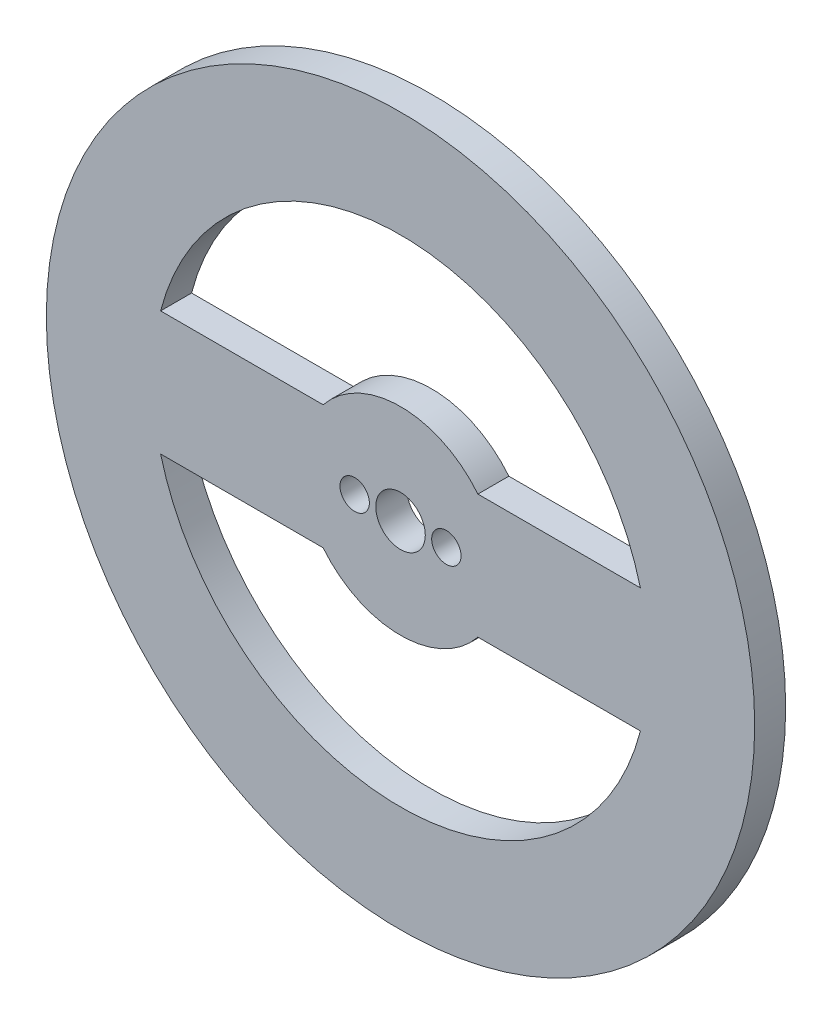
ISO-10303-21;
HEADER;
FILE_DESCRIPTION(('STEP AP214'),'2;1');
FILE_NAME('part.step','',(''),(''),'','','');
FILE_SCHEMA(('AUTOMOTIVE_DESIGN { 1 0 10303 214 1 1 1 1 }'));
ENDSEC;
DATA;
#1=APPLICATION_CONTEXT('core data for automotive mechanical design processes');
#2=APPLICATION_PROTOCOL_DEFINITION('international standard','automotive_design',2000,#1);
#3=PRODUCT_CONTEXT('',#1,'mechanical');
#4=PRODUCT('Part','Part','',(#3));
#5=PRODUCT_RELATED_PRODUCT_CATEGORY('part','',(#4));
#6=PRODUCT_DEFINITION_FORMATION('','',#4);
#7=PRODUCT_DEFINITION_CONTEXT('part definition',#1,'design');
#8=PRODUCT_DEFINITION('design','',#6,#7);
#9=PRODUCT_DEFINITION_SHAPE('','',#8);
#10=(LENGTH_UNIT() NAMED_UNIT(*) SI_UNIT(.MILLI.,.METRE.));
#11=(NAMED_UNIT(*) PLANE_ANGLE_UNIT() SI_UNIT($,.RADIAN.));
#12=(NAMED_UNIT(*) SI_UNIT($,.STERADIAN.) SOLID_ANGLE_UNIT());
#13=UNCERTAINTY_MEASURE_WITH_UNIT(LENGTH_MEASURE(1.E-05),#10,'distance_accuracy_value','');
#14=(GEOMETRIC_REPRESENTATION_CONTEXT(3) GLOBAL_UNCERTAINTY_ASSIGNED_CONTEXT((#13)) GLOBAL_UNIT_ASSIGNED_CONTEXT((#10,
#11,#12)) REPRESENTATION_CONTEXT('',''));
#15=CARTESIAN_POINT('',(0.,0.,0.));
#16=DIRECTION('',(0.,0.,1.));
#17=DIRECTION('',(1.,0.,0.));
#18=AXIS2_PLACEMENT_3D('',#15,#16,#17);
#19=CARTESIAN_POINT('',(0.,0.,3.175));
#20=DIRECTION('',(0.,0.,-1.));
#21=DIRECTION('',(-1.,0.,0.));
#22=AXIS2_PLACEMENT_3D('',#19,#20,#21);
#23=CYLINDRICAL_SURFACE('',#22,36.3093);
#24=CARTESIAN_POINT('',(0.,0.,3.175));
#25=DIRECTION('',(0.,0.,1.));
#26=DIRECTION('',(1.,0.,0.));
#27=AXIS2_PLACEMENT_3D('',#24,#25,#26);
#28=CIRCLE('',#27,36.3093);
#29=CARTESIAN_POINT('',(36.3093,0.,3.175));
#30=VERTEX_POINT('',#29);
#31=EDGE_CURVE('E11',#30,#30,#28,.T.);
#32=ORIENTED_EDGE('',*,*,#31,.F.);
#33=EDGE_LOOP('',(#32));
#34=FACE_BOUND('',#33,.T.);
#35=CARTESIAN_POINT('',(0.,0.,0.));
#36=DIRECTION('',(0.,0.,1.));
#37=DIRECTION('',(1.,0.,0.));
#38=AXIS2_PLACEMENT_3D('',#35,#36,#37);
#39=CIRCLE('',#38,36.3093);
#40=CARTESIAN_POINT('',(36.3093,0.,0.));
#41=VERTEX_POINT('',#40);
#42=EDGE_CURVE('E36',#41,#41,#39,.T.);
#43=ORIENTED_EDGE('',*,*,#42,.T.);
#44=EDGE_LOOP('',(#43));
#45=FACE_BOUND('',#44,.T.);
#46=ADVANCED_FACE('F33',(#34,#45),#23,.T.);
#47=CARTESIAN_POINT('',(0.,0.,3.175));
#48=DIRECTION('',(0.,0.,1.));
#49=DIRECTION('',(1.,0.,0.));
#50=AXIS2_PLACEMENT_3D('',#47,#48,#49);
#51=PLANE('',#50);
#52=CARTESIAN_POINT('',(0.,0.,3.175));
#53=DIRECTION('',(0.,0.,1.));
#54=DIRECTION('',(1.,0.,0.));
#55=AXIS2_PLACEMENT_3D('',#52,#53,#54);
#56=CIRCLE('',#55,2.54);
#57=CARTESIAN_POINT('',(2.54,0.,3.175));
#58=VERTEX_POINT('',#57);
#59=EDGE_CURVE('E251',#58,#58,#56,.T.);
#60=ORIENTED_EDGE('',*,*,#59,.F.);
#61=EDGE_LOOP('',(#60));
#62=FACE_BOUND('',#61,.T.);
#63=CARTESIAN_POINT('',(4.699,0.,3.175));
#64=DIRECTION('',(0.,0.,1.));
#65=DIRECTION('',(1.,0.,0.));
#66=AXIS2_PLACEMENT_3D('',#63,#64,#65);
#67=CIRCLE('',#66,1.505);
#68=CARTESIAN_POINT('',(6.204,0.,3.175));
#69=VERTEX_POINT('',#68);
#70=EDGE_CURVE('E253',#69,#69,#67,.T.);
#71=ORIENTED_EDGE('',*,*,#70,.F.);
#72=EDGE_LOOP('',(#71));
#73=FACE_BOUND('',#72,.T.);
#74=CARTESIAN_POINT('',(-4.699,0.,3.175));
#75=DIRECTION('',(0.,0.,1.));
#76=DIRECTION('',(1.,0.,0.));
#77=AXIS2_PLACEMENT_3D('',#74,#75,#76);
#78=CIRCLE('',#77,1.505);
#79=CARTESIAN_POINT('',(-3.194,0.,3.175));
#80=VERTEX_POINT('',#79);
#81=EDGE_CURVE('E121',#80,#80,#78,.T.);
#82=ORIENTED_EDGE('',*,*,#81,.F.);
#83=EDGE_LOOP('',(#82));
#84=FACE_BOUND('',#83,.T.);
#85=CARTESIAN_POINT('',(0.,0.,3.175));
#86=DIRECTION('',(0.,0.,1.));
#87=DIRECTION('',(1.,0.,0.));
#88=AXIS2_PLACEMENT_3D('',#85,#86,#87);
#89=CIRCLE('',#88,25.4);
#90=CARTESIAN_POINT('',(-24.5934442484171,-6.35,3.175));
#91=VERTEX_POINT('',#90);
#92=CARTESIAN_POINT('',(24.5934442484171,-6.35,3.175));
#93=VERTEX_POINT('',#92);
#94=EDGE_CURVE('E47',#91,#93,#89,.T.);
#95=ORIENTED_EDGE('',*,*,#94,.F.);
#96=DIRECTION('',(-1.,0.,0.));
#97=VECTOR('',#96,1.);
#98=CARTESIAN_POINT('',(-24.5934442484171,-6.35,3.175));
#99=LINE('',#98,#97);
#100=CARTESIAN_POINT('',(-7.93114745796597,-6.35,3.175));
#101=VERTEX_POINT('',#100);
#102=EDGE_CURVE('E115',#101,#91,#99,.T.);
#103=ORIENTED_EDGE('',*,*,#102,.F.);
#104=CARTESIAN_POINT('',(0.,0.,3.175));
#105=DIRECTION('',(0.,0.,-1.));
#106=DIRECTION('',(1.,0.,0.));
#107=AXIS2_PLACEMENT_3D('',#104,#105,#106);
#108=CIRCLE('',#107,10.16);
#109=CARTESIAN_POINT('',(7.93114745796596,-6.35,3.175));
#110=VERTEX_POINT('',#109);
#111=EDGE_CURVE('E118',#110,#101,#108,.T.);
#112=ORIENTED_EDGE('',*,*,#111,.F.);
#113=DIRECTION('',(-1.,0.,0.));
#114=VECTOR('',#113,1.);
#115=CARTESIAN_POINT('',(7.93114745796597,-6.35,3.175));
#116=LINE('',#115,#114);
#117=EDGE_CURVE('E127',#93,#110,#116,.T.);
#118=ORIENTED_EDGE('',*,*,#117,.F.);
#119=EDGE_LOOP('',(#95,#103,#112,#118));
#120=FACE_BOUND('',#119,.T.);
#121=CARTESIAN_POINT('',(0.,0.,3.175));
#122=DIRECTION('',(0.,0.,-1.));
#123=DIRECTION('',(1.,0.,0.));
#124=AXIS2_PLACEMENT_3D('',#121,#122,#123);
#125=CIRCLE('',#124,10.16);
#126=CARTESIAN_POINT('',(-7.93114745796597,6.35,3.175));
#127=VERTEX_POINT('',#126);
#128=CARTESIAN_POINT('',(7.93114745796597,6.35,3.175));
#129=VERTEX_POINT('',#128);
#130=EDGE_CURVE('E134',#127,#129,#125,.T.);
#131=ORIENTED_EDGE('',*,*,#130,.F.);
#132=DIRECTION('',(1.,0.,0.));
#133=VECTOR('',#132,1.);
#134=CARTESIAN_POINT('',(-24.5934442484171,6.35,3.175));
#135=LINE('',#134,#133);
#136=CARTESIAN_POINT('',(-24.5934442484171,6.35,3.175));
#137=VERTEX_POINT('',#136);
#138=EDGE_CURVE('E142',#137,#127,#135,.T.);
#139=ORIENTED_EDGE('',*,*,#138,.F.);
#140=CARTESIAN_POINT('',(0.,0.,3.175));
#141=DIRECTION('',(0.,0.,1.));
#142=DIRECTION('',(1.,0.,0.));
#143=AXIS2_PLACEMENT_3D('',#140,#141,#142);
#144=CIRCLE('',#143,25.4);
#145=CARTESIAN_POINT('',(24.5934442484171,6.35,3.175));
#146=VERTEX_POINT('',#145);
#147=EDGE_CURVE('E156',#146,#137,#144,.T.);
#148=ORIENTED_EDGE('',*,*,#147,.F.);
#149=DIRECTION('',(1.,0.,0.));
#150=VECTOR('',#149,1.);
#151=CARTESIAN_POINT('',(7.93114745796597,6.35,3.175));
#152=LINE('',#151,#150);
#153=EDGE_CURVE('E153',#129,#146,#152,.T.);
#154=ORIENTED_EDGE('',*,*,#153,.F.);
#155=EDGE_LOOP('',(#131,#139,#148,#154));
#156=FACE_BOUND('',#155,.T.);
#157=ORIENTED_EDGE('',*,*,#31,.T.);
#158=EDGE_LOOP('',(#157));
#159=FACE_BOUND('',#158,.T.);
#160=ADVANCED_FACE('F178',(#62,#73,#84,#120,#156,#159),#51,.T.);
#161=CARTESIAN_POINT('',(0.,0.,0.));
#162=DIRECTION('',(0.,0.,1.));
#163=DIRECTION('',(1.,0.,0.));
#164=AXIS2_PLACEMENT_3D('',#161,#162,#163);
#165=PLANE('',#164);
#166=CARTESIAN_POINT('',(0.,0.,0.));
#167=DIRECTION('',(0.,0.,1.));
#168=DIRECTION('',(1.,0.,0.));
#169=AXIS2_PLACEMENT_3D('',#166,#167,#168);
#170=CIRCLE('',#169,2.54);
#171=CARTESIAN_POINT('',(2.54,0.,0.));
#172=VERTEX_POINT('',#171);
#173=EDGE_CURVE('E248',#172,#172,#170,.T.);
#174=ORIENTED_EDGE('',*,*,#173,.T.);
#175=EDGE_LOOP('',(#174));
#176=FACE_BOUND('',#175,.T.);
#177=CARTESIAN_POINT('',(4.699,0.,0.));
#178=DIRECTION('',(0.,0.,1.));
#179=DIRECTION('',(1.,0.,0.));
#180=AXIS2_PLACEMENT_3D('',#177,#178,#179);
#181=CIRCLE('',#180,1.505);
#182=CARTESIAN_POINT('',(6.204,0.,0.));
#183=VERTEX_POINT('',#182);
#184=EDGE_CURVE('E256',#183,#183,#181,.T.);
#185=ORIENTED_EDGE('',*,*,#184,.T.);
#186=EDGE_LOOP('',(#185));
#187=FACE_BOUND('',#186,.T.);
#188=CARTESIAN_POINT('',(-4.699,0.,0.));
#189=DIRECTION('',(0.,0.,1.));
#190=DIRECTION('',(1.,0.,0.));
#191=AXIS2_PLACEMENT_3D('',#188,#189,#190);
#192=CIRCLE('',#191,1.505);
#193=CARTESIAN_POINT('',(-3.194,0.,0.));
#194=VERTEX_POINT('',#193);
#195=EDGE_CURVE('E128',#194,#194,#192,.T.);
#196=ORIENTED_EDGE('',*,*,#195,.T.);
#197=EDGE_LOOP('',(#196));
#198=FACE_BOUND('',#197,.T.);
#199=DIRECTION('',(-1.,0.,0.));
#200=VECTOR('',#199,1.);
#201=CARTESIAN_POINT('',(-24.5934442484171,-6.35,0.));
#202=LINE('',#201,#200);
#203=CARTESIAN_POINT('',(-7.93114745796597,-6.35,0.));
#204=VERTEX_POINT('',#203);
#205=CARTESIAN_POINT('',(-24.5934442484171,-6.35,0.));
#206=VERTEX_POINT('',#205);
#207=EDGE_CURVE('E105',#204,#206,#202,.T.);
#208=ORIENTED_EDGE('',*,*,#207,.T.);
#209=CARTESIAN_POINT('',(0.,0.,0.));
#210=DIRECTION('',(0.,0.,1.));
#211=DIRECTION('',(1.,0.,0.));
#212=AXIS2_PLACEMENT_3D('',#209,#210,#211);
#213=CIRCLE('',#212,25.4);
#214=CARTESIAN_POINT('',(24.5934442484171,-6.35,0.));
#215=VERTEX_POINT('',#214);
#216=EDGE_CURVE('E99',#206,#215,#213,.T.);
#217=ORIENTED_EDGE('',*,*,#216,.T.);
#218=DIRECTION('',(-1.,0.,0.));
#219=VECTOR('',#218,1.);
#220=CARTESIAN_POINT('',(7.93114745796597,-6.35,0.));
#221=LINE('',#220,#219);
#222=CARTESIAN_POINT('',(7.93114745796596,-6.35,0.));
#223=VERTEX_POINT('',#222);
#224=EDGE_CURVE('E108',#215,#223,#221,.T.);
#225=ORIENTED_EDGE('',*,*,#224,.T.);
#226=CARTESIAN_POINT('',(0.,0.,0.));
#227=DIRECTION('',(0.,0.,-1.));
#228=DIRECTION('',(1.,0.,0.));
#229=AXIS2_PLACEMENT_3D('',#226,#227,#228);
#230=CIRCLE('',#229,10.16);
#231=EDGE_CURVE('E55',#223,#204,#230,.T.);
#232=ORIENTED_EDGE('',*,*,#231,.T.);
#233=EDGE_LOOP('',(#208,#217,#225,#232));
#234=FACE_BOUND('',#233,.T.);
#235=DIRECTION('',(1.,0.,0.));
#236=VECTOR('',#235,1.);
#237=CARTESIAN_POINT('',(-24.5934442484171,6.35,0.));
#238=LINE('',#237,#236);
#239=CARTESIAN_POINT('',(-24.5934442484171,6.35,0.));
#240=VERTEX_POINT('',#239);
#241=CARTESIAN_POINT('',(-7.93114745796597,6.35,0.));
#242=VERTEX_POINT('',#241);
#243=EDGE_CURVE('E148',#240,#242,#238,.T.);
#244=ORIENTED_EDGE('',*,*,#243,.T.);
#245=CARTESIAN_POINT('',(0.,0.,0.));
#246=DIRECTION('',(0.,0.,-1.));
#247=DIRECTION('',(1.,0.,0.));
#248=AXIS2_PLACEMENT_3D('',#245,#246,#247);
#249=CIRCLE('',#248,10.16);
#250=CARTESIAN_POINT('',(7.93114745796597,6.35,0.));
#251=VERTEX_POINT('',#250);
#252=EDGE_CURVE('E138',#242,#251,#249,.T.);
#253=ORIENTED_EDGE('',*,*,#252,.T.);
#254=DIRECTION('',(1.,0.,0.));
#255=VECTOR('',#254,1.);
#256=CARTESIAN_POINT('',(7.93114745796597,6.35,0.));
#257=LINE('',#256,#255);
#258=CARTESIAN_POINT('',(24.5934442484171,6.35,0.));
#259=VERTEX_POINT('',#258);
#260=EDGE_CURVE('E141',#251,#259,#257,.T.);
#261=ORIENTED_EDGE('',*,*,#260,.T.);
#262=CARTESIAN_POINT('',(0.,0.,0.));
#263=DIRECTION('',(0.,0.,1.));
#264=DIRECTION('',(1.,0.,0.));
#265=AXIS2_PLACEMENT_3D('',#262,#263,#264);
#266=CIRCLE('',#265,25.4);
#267=EDGE_CURVE('E145',#259,#240,#266,.T.);
#268=ORIENTED_EDGE('',*,*,#267,.T.);
#269=EDGE_LOOP('',(#244,#253,#261,#268));
#270=FACE_BOUND('',#269,.T.);
#271=ORIENTED_EDGE('',*,*,#42,.F.);
#272=EDGE_LOOP('',(#271));
#273=FACE_BOUND('',#272,.T.);
#274=ADVANCED_FACE('F112',(#176,#187,#198,#234,#270,#273),#165,.F.);
#275=CARTESIAN_POINT('',(0.,0.,0.));
#276=DIRECTION('',(0.,0.,1.));
#277=DIRECTION('',(1.,0.,0.));
#278=AXIS2_PLACEMENT_3D('',#275,#276,#277);
#279=CYLINDRICAL_SURFACE('',#278,10.16);
#280=ORIENTED_EDGE('',*,*,#130,.T.);
#281=DIRECTION('',(0.,0.,1.));
#282=VECTOR('',#281,1.);
#283=CARTESIAN_POINT('',(7.93114745796597,6.35,0.));
#284=LINE('',#283,#282);
#285=EDGE_CURVE('E151',#251,#129,#284,.T.);
#286=ORIENTED_EDGE('',*,*,#285,.F.);
#287=ORIENTED_EDGE('',*,*,#252,.F.);
#288=DIRECTION('',(0.,0.,1.));
#289=VECTOR('',#288,1.);
#290=CARTESIAN_POINT('',(-7.93114745796597,6.35,0.));
#291=LINE('',#290,#289);
#292=EDGE_CURVE('E161',#242,#127,#291,.T.);
#293=ORIENTED_EDGE('',*,*,#292,.T.);
#294=EDGE_LOOP('',(#280,#286,#287,#293));
#295=FACE_BOUND('',#294,.T.);
#296=ADVANCED_FACE('F185',(#295),#279,.T.);
#297=CARTESIAN_POINT('',(-24.5934442484171,6.35,0.));
#298=DIRECTION('',(0.,-1.,0.));
#299=DIRECTION('',(1.,0.,0.));
#300=AXIS2_PLACEMENT_3D('',#297,#298,#299);
#301=PLANE('',#300);
#302=ORIENTED_EDGE('',*,*,#138,.T.);
#303=ORIENTED_EDGE('',*,*,#292,.F.);
#304=ORIENTED_EDGE('',*,*,#243,.F.);
#305=DIRECTION('',(0.,0.,1.));
#306=VECTOR('',#305,1.);
#307=CARTESIAN_POINT('',(-24.5934442484171,6.35,0.));
#308=LINE('',#307,#306);
#309=EDGE_CURVE('E163',#240,#137,#308,.T.);
#310=ORIENTED_EDGE('',*,*,#309,.T.);
#311=EDGE_LOOP('',(#302,#303,#304,#310));
#312=FACE_BOUND('',#311,.T.);
#313=ADVANCED_FACE('F187',(#312),#301,.F.);
#314=CARTESIAN_POINT('',(0.,0.,0.));
#315=DIRECTION('',(0.,0.,1.));
#316=DIRECTION('',(1.,0.,0.));
#317=AXIS2_PLACEMENT_3D('',#314,#315,#316);
#318=CYLINDRICAL_SURFACE('',#317,25.4);
#319=ORIENTED_EDGE('',*,*,#147,.T.);
#320=ORIENTED_EDGE('',*,*,#309,.F.);
#321=ORIENTED_EDGE('',*,*,#267,.F.);
#322=DIRECTION('',(0.,0.,1.));
#323=VECTOR('',#322,1.);
#324=CARTESIAN_POINT('',(24.5934442484171,6.35,0.));
#325=LINE('',#324,#323);
#326=EDGE_CURVE('E165',#259,#146,#325,.T.);
#327=ORIENTED_EDGE('',*,*,#326,.T.);
#328=EDGE_LOOP('',(#319,#320,#321,#327));
#329=FACE_BOUND('',#328,.T.);
#330=ADVANCED_FACE('F182',(#329),#318,.F.);
#331=CARTESIAN_POINT('',(7.93114745796597,6.35,0.));
#332=DIRECTION('',(0.,-1.,0.));
#333=DIRECTION('',(1.,0.,0.));
#334=AXIS2_PLACEMENT_3D('',#331,#332,#333);
#335=PLANE('',#334);
#336=ORIENTED_EDGE('',*,*,#153,.T.);
#337=ORIENTED_EDGE('',*,*,#326,.F.);
#338=ORIENTED_EDGE('',*,*,#260,.F.);
#339=ORIENTED_EDGE('',*,*,#285,.T.);
#340=EDGE_LOOP('',(#336,#337,#338,#339));
#341=FACE_BOUND('',#340,.T.);
#342=ADVANCED_FACE('F171',(#341),#335,.F.);
#343=CARTESIAN_POINT('',(0.,0.,0.));
#344=DIRECTION('',(0.,0.,1.));
#345=DIRECTION('',(1.,0.,0.));
#346=AXIS2_PLACEMENT_3D('',#343,#344,#345);
#347=CYLINDRICAL_SURFACE('',#346,25.4);
#348=ORIENTED_EDGE('',*,*,#94,.T.);
#349=DIRECTION('',(0.,0.,1.));
#350=VECTOR('',#349,1.);
#351=CARTESIAN_POINT('',(24.5934442484171,-6.35,0.));
#352=LINE('',#351,#350);
#353=EDGE_CURVE('E95',#215,#93,#352,.T.);
#354=ORIENTED_EDGE('',*,*,#353,.F.);
#355=ORIENTED_EDGE('',*,*,#216,.F.);
#356=DIRECTION('',(0.,0.,1.));
#357=VECTOR('',#356,1.);
#358=CARTESIAN_POINT('',(-24.5934442484171,-6.35,0.));
#359=LINE('',#358,#357);
#360=EDGE_CURVE('E132',#206,#91,#359,.T.);
#361=ORIENTED_EDGE('',*,*,#360,.T.);
#362=EDGE_LOOP('',(#348,#354,#355,#361));
#363=FACE_BOUND('',#362,.T.);
#364=ADVANCED_FACE('F97',(#363),#347,.F.);
#365=CARTESIAN_POINT('',(-24.5934442484171,-6.35,0.));
#366=DIRECTION('',(0.,1.,0.));
#367=DIRECTION('',(0.,0.,1.));
#368=AXIS2_PLACEMENT_3D('',#365,#366,#367);
#369=PLANE('',#368);
#370=ORIENTED_EDGE('',*,*,#102,.T.);
#371=ORIENTED_EDGE('',*,*,#360,.F.);
#372=ORIENTED_EDGE('',*,*,#207,.F.);
#373=DIRECTION('',(0.,0.,1.));
#374=VECTOR('',#373,1.);
#375=CARTESIAN_POINT('',(-7.93114745796597,-6.35,0.));
#376=LINE('',#375,#374);
#377=EDGE_CURVE('E135',#204,#101,#376,.T.);
#378=ORIENTED_EDGE('',*,*,#377,.T.);
#379=EDGE_LOOP('',(#370,#371,#372,#378));
#380=FACE_BOUND('',#379,.T.);
#381=ADVANCED_FACE('F221',(#380),#369,.F.);
#382=CARTESIAN_POINT('',(0.,0.,0.));
#383=DIRECTION('',(0.,0.,1.));
#384=DIRECTION('',(1.,0.,0.));
#385=AXIS2_PLACEMENT_3D('',#382,#383,#384);
#386=CYLINDRICAL_SURFACE('',#385,10.16);
#387=ORIENTED_EDGE('',*,*,#111,.T.);
#388=ORIENTED_EDGE('',*,*,#377,.F.);
#389=ORIENTED_EDGE('',*,*,#231,.F.);
#390=DIRECTION('',(0.,0.,1.));
#391=VECTOR('',#390,1.);
#392=CARTESIAN_POINT('',(7.93114745796596,-6.35,0.));
#393=LINE('',#392,#391);
#394=EDGE_CURVE('E104',#223,#110,#393,.T.);
#395=ORIENTED_EDGE('',*,*,#394,.T.);
#396=EDGE_LOOP('',(#387,#388,#389,#395));
#397=FACE_BOUND('',#396,.T.);
#398=ADVANCED_FACE('F225',(#397),#386,.T.);
#399=CARTESIAN_POINT('',(7.93114745796597,-6.35,0.));
#400=DIRECTION('',(0.,1.,0.));
#401=DIRECTION('',(0.,0.,1.));
#402=AXIS2_PLACEMENT_3D('',#399,#400,#401);
#403=PLANE('',#402);
#404=ORIENTED_EDGE('',*,*,#117,.T.);
#405=ORIENTED_EDGE('',*,*,#394,.F.);
#406=ORIENTED_EDGE('',*,*,#224,.F.);
#407=ORIENTED_EDGE('',*,*,#353,.T.);
#408=EDGE_LOOP('',(#404,#405,#406,#407));
#409=FACE_BOUND('',#408,.T.);
#410=ADVANCED_FACE('F109',(#409),#403,.F.);
#411=CARTESIAN_POINT('',(-4.699,0.,0.));
#412=DIRECTION('',(0.,0.,1.));
#413=DIRECTION('',(1.,0.,0.));
#414=AXIS2_PLACEMENT_3D('',#411,#412,#413);
#415=CYLINDRICAL_SURFACE('',#414,1.505);
#416=ORIENTED_EDGE('',*,*,#195,.F.);
#417=EDGE_LOOP('',(#416));
#418=FACE_BOUND('',#417,.T.);
#419=ORIENTED_EDGE('',*,*,#81,.T.);
#420=EDGE_LOOP('',(#419));
#421=FACE_BOUND('',#420,.T.);
#422=ADVANCED_FACE('F231',(#418,#421),#415,.F.);
#423=CARTESIAN_POINT('',(4.699,0.,0.));
#424=DIRECTION('',(0.,0.,1.));
#425=DIRECTION('',(1.,0.,0.));
#426=AXIS2_PLACEMENT_3D('',#423,#424,#425);
#427=CYLINDRICAL_SURFACE('',#426,1.505);
#428=ORIENTED_EDGE('',*,*,#184,.F.);
#429=EDGE_LOOP('',(#428));
#430=FACE_BOUND('',#429,.T.);
#431=ORIENTED_EDGE('',*,*,#70,.T.);
#432=EDGE_LOOP('',(#431));
#433=FACE_BOUND('',#432,.T.);
#434=ADVANCED_FACE('F236',(#430,#433),#427,.F.);
#435=CARTESIAN_POINT('',(0.,0.,0.));
#436=DIRECTION('',(0.,0.,1.));
#437=DIRECTION('',(1.,0.,0.));
#438=AXIS2_PLACEMENT_3D('',#435,#436,#437);
#439=CYLINDRICAL_SURFACE('',#438,2.54);
#440=ORIENTED_EDGE('',*,*,#173,.F.);
#441=EDGE_LOOP('',(#440));
#442=FACE_BOUND('',#441,.T.);
#443=ORIENTED_EDGE('',*,*,#59,.T.);
#444=EDGE_LOOP('',(#443));
#445=FACE_BOUND('',#444,.T.);
#446=ADVANCED_FACE('F240',(#442,#445),#439,.F.);
#447=CLOSED_SHELL('',(#46,#160,#274,#296,#313,#330,#342,#364,#381,#398,#410,#422,#434,#446));
#448=MANIFOLD_SOLID_BREP('B2',#447);
#449=ADVANCED_BREP_SHAPE_REPRESENTATION('',(#18,#448),#14);
#450=SHAPE_DEFINITION_REPRESENTATION(#9,#449);
ENDSEC;
END-ISO-10303-21;
